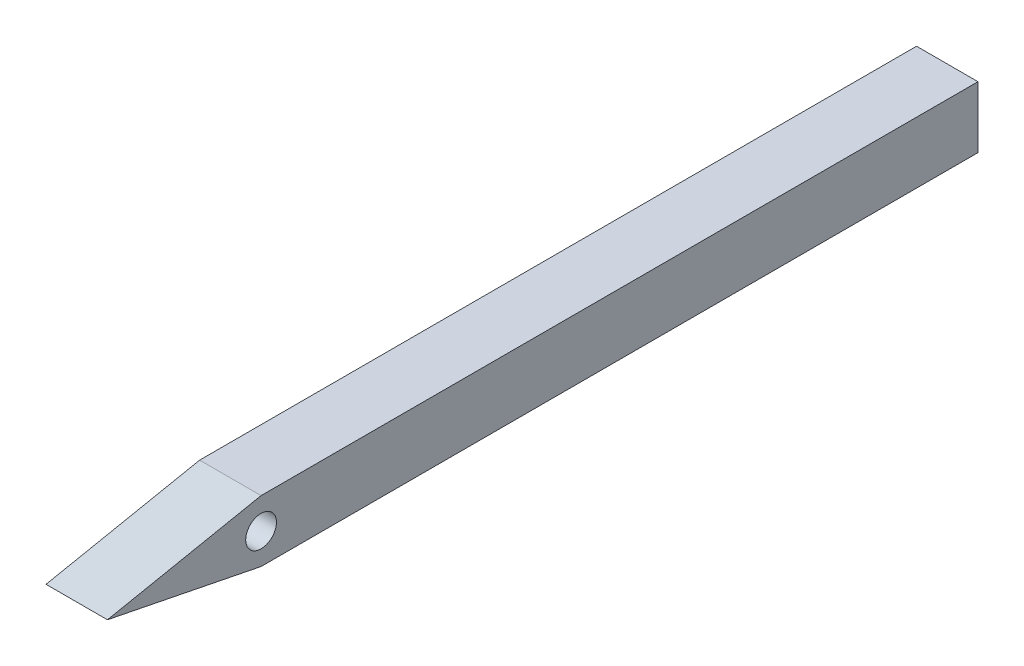
ISO-10303-21;
HEADER;
FILE_DESCRIPTION(('STEP AP214'),'2;1');
FILE_NAME('part.step','',(''),(''),'','','');
FILE_SCHEMA(('AUTOMOTIVE_DESIGN { 1 0 10303 214 1 1 1 1 }'));
ENDSEC;
DATA;
#1=APPLICATION_CONTEXT('core data for automotive mechanical design processes');
#2=APPLICATION_PROTOCOL_DEFINITION('international standard','automotive_design',2000,#1);
#3=PRODUCT_CONTEXT('',#1,'mechanical');
#4=PRODUCT('Part','Part','',(#3));
#5=PRODUCT_RELATED_PRODUCT_CATEGORY('part','',(#4));
#6=PRODUCT_DEFINITION_FORMATION('','',#4);
#7=PRODUCT_DEFINITION_CONTEXT('part definition',#1,'design');
#8=PRODUCT_DEFINITION('design','',#6,#7);
#9=PRODUCT_DEFINITION_SHAPE('','',#8);
#10=(LENGTH_UNIT() NAMED_UNIT(*) SI_UNIT(.MILLI.,.METRE.));
#11=(NAMED_UNIT(*) PLANE_ANGLE_UNIT() SI_UNIT($,.RADIAN.));
#12=(NAMED_UNIT(*) SI_UNIT($,.STERADIAN.) SOLID_ANGLE_UNIT());
#13=UNCERTAINTY_MEASURE_WITH_UNIT(LENGTH_MEASURE(1.E-05),#10,'distance_accuracy_value','');
#14=(GEOMETRIC_REPRESENTATION_CONTEXT(3) GLOBAL_UNCERTAINTY_ASSIGNED_CONTEXT((#13)) GLOBAL_UNIT_ASSIGNED_CONTEXT((#10,
#11,#12)) REPRESENTATION_CONTEXT('',''));
#15=CARTESIAN_POINT('',(0.,0.,0.));
#16=DIRECTION('',(0.,0.,1.));
#17=DIRECTION('',(1.,0.,0.));
#18=AXIS2_PLACEMENT_3D('',#15,#16,#17);
#19=CARTESIAN_POINT('',(6.,0.,0.));
#20=DIRECTION('',(0.,0.,1.));
#21=DIRECTION('',(1.,0.,0.));
#22=AXIS2_PLACEMENT_3D('',#19,#20,#21);
#23=PLANE('',#22);
#24=DIRECTION('',(0.,1.,0.));
#25=VECTOR('',#24,1.);
#26=CARTESIAN_POINT('',(0.,0.,0.));
#27=LINE('',#26,#25);
#28=CARTESIAN_POINT('',(0.,0.,0.));
#29=VERTEX_POINT('',#28);
#30=CARTESIAN_POINT('',(0.,6.,0.));
#31=VERTEX_POINT('',#30);
#32=EDGE_CURVE('E107',#29,#31,#27,.T.);
#33=ORIENTED_EDGE('',*,*,#32,.T.);
#34=DIRECTION('',(-1.,0.,0.));
#35=VECTOR('',#34,1.);
#36=CARTESIAN_POINT('',(6.,6.,0.));
#37=LINE('',#36,#35);
#38=CARTESIAN_POINT('',(6.,6.,0.));
#39=VERTEX_POINT('',#38);
#40=EDGE_CURVE('E11',#39,#31,#37,.T.);
#41=ORIENTED_EDGE('',*,*,#40,.F.);
#42=DIRECTION('',(0.,1.,0.));
#43=VECTOR('',#42,1.);
#44=CARTESIAN_POINT('',(6.,0.,0.));
#45=LINE('',#44,#43);
#46=CARTESIAN_POINT('',(6.,0.,0.));
#47=VERTEX_POINT('',#46);
#48=EDGE_CURVE('E116',#47,#39,#45,.T.);
#49=ORIENTED_EDGE('',*,*,#48,.F.);
#50=DIRECTION('',(-1.,0.,0.));
#51=VECTOR('',#50,1.);
#52=CARTESIAN_POINT('',(6.,0.,0.));
#53=LINE('',#52,#51);
#54=EDGE_CURVE('E103',#47,#29,#53,.T.);
#55=ORIENTED_EDGE('',*,*,#54,.T.);
#56=EDGE_LOOP('',(#33,#41,#49,#55));
#57=FACE_BOUND('',#56,.T.);
#58=ADVANCED_FACE('F33',(#57),#23,.F.);
#59=CARTESIAN_POINT('',(6.,6.,0.));
#60=DIRECTION('',(0.,-1.,0.));
#61=DIRECTION('',(0.,0.,-1.));
#62=AXIS2_PLACEMENT_3D('',#59,#60,#61);
#63=PLANE('',#62);
#64=DIRECTION('',(0.,0.,1.));
#65=VECTOR('',#64,1.);
#66=CARTESIAN_POINT('',(0.,6.,0.));
#67=LINE('',#66,#65);
#68=CARTESIAN_POINT('',(0.,5.99999999999999,70.));
#69=VERTEX_POINT('',#68);
#70=EDGE_CURVE('E110',#31,#69,#67,.T.);
#71=ORIENTED_EDGE('',*,*,#70,.T.);
#72=DIRECTION('',(-1.,0.,0.));
#73=VECTOR('',#72,1.);
#74=CARTESIAN_POINT('',(6.,5.99999999999999,70.));
#75=LINE('',#74,#73);
#76=CARTESIAN_POINT('',(6.,5.99999999999999,70.));
#77=VERTEX_POINT('',#76);
#78=EDGE_CURVE('E41',#77,#69,#75,.T.);
#79=ORIENTED_EDGE('',*,*,#78,.F.);
#80=DIRECTION('',(0.,0.,1.));
#81=VECTOR('',#80,1.);
#82=CARTESIAN_POINT('',(6.,6.,0.));
#83=LINE('',#82,#81);
#84=EDGE_CURVE('E83',#39,#77,#83,.T.);
#85=ORIENTED_EDGE('',*,*,#84,.F.);
#86=ORIENTED_EDGE('',*,*,#40,.T.);
#87=EDGE_LOOP('',(#71,#79,#85,#86));
#88=FACE_BOUND('',#87,.T.);
#89=ADVANCED_FACE('F136',(#88),#63,.F.);
#90=CARTESIAN_POINT('',(6.,5.99999999999999,70.));
#91=DIRECTION('',(0.,-0.98058067569092,-0.196116135138183));
#92=DIRECTION('',(0.,0.196116135138184,-0.98058067569092));
#93=AXIS2_PLACEMENT_3D('',#90,#91,#92);
#94=PLANE('',#93);
#95=DIRECTION('',(0.,-0.196116135138183,0.98058067569092));
#96=VECTOR('',#95,1.);
#97=CARTESIAN_POINT('',(0.,5.99999999999999,70.));
#98=LINE('',#97,#96);
#99=CARTESIAN_POINT('',(0.,3.,85.));
#100=VERTEX_POINT('',#99);
#101=EDGE_CURVE('E98',#69,#100,#98,.T.);
#102=ORIENTED_EDGE('',*,*,#101,.T.);
#103=DIRECTION('',(-1.,0.,0.));
#104=VECTOR('',#103,1.);
#105=CARTESIAN_POINT('',(6.,3.,85.));
#106=LINE('',#105,#104);
#107=CARTESIAN_POINT('',(6.,3.,85.));
#108=VERTEX_POINT('',#107);
#109=EDGE_CURVE('E95',#108,#100,#106,.T.);
#110=ORIENTED_EDGE('',*,*,#109,.F.);
#111=DIRECTION('',(0.,-0.196116135138183,0.98058067569092));
#112=VECTOR('',#111,1.);
#113=CARTESIAN_POINT('',(6.,5.99999999999999,70.));
#114=LINE('',#113,#112);
#115=EDGE_CURVE('E87',#77,#108,#114,.T.);
#116=ORIENTED_EDGE('',*,*,#115,.F.);
#117=ORIENTED_EDGE('',*,*,#78,.T.);
#118=EDGE_LOOP('',(#102,#110,#116,#117));
#119=FACE_BOUND('',#118,.T.);
#120=ADVANCED_FACE('F96',(#119),#94,.F.);
#121=CARTESIAN_POINT('',(6.,3.,85.));
#122=DIRECTION('',(0.,0.98058067569092,-0.196116135138185));
#123=DIRECTION('',(0.,0.196116135138185,0.98058067569092));
#124=AXIS2_PLACEMENT_3D('',#121,#122,#123);
#125=PLANE('',#124);
#126=DIRECTION('',(0.,-0.196116135138185,-0.98058067569092));
#127=VECTOR('',#126,1.);
#128=CARTESIAN_POINT('',(0.,3.,85.));
#129=LINE('',#128,#127);
#130=CARTESIAN_POINT('',(0.,0.,70.));
#131=VERTEX_POINT('',#130);
#132=EDGE_CURVE('E69',#100,#131,#129,.T.);
#133=ORIENTED_EDGE('',*,*,#132,.T.);
#134=DIRECTION('',(-1.,0.,0.));
#135=VECTOR('',#134,1.);
#136=CARTESIAN_POINT('',(6.,0.,70.));
#137=LINE('',#136,#135);
#138=CARTESIAN_POINT('',(6.,0.,70.));
#139=VERTEX_POINT('',#138);
#140=EDGE_CURVE('E99',#139,#131,#137,.T.);
#141=ORIENTED_EDGE('',*,*,#140,.F.);
#142=DIRECTION('',(0.,-0.196116135138185,-0.98058067569092));
#143=VECTOR('',#142,1.);
#144=CARTESIAN_POINT('',(6.,3.,85.));
#145=LINE('',#144,#143);
#146=EDGE_CURVE('E91',#108,#139,#145,.T.);
#147=ORIENTED_EDGE('',*,*,#146,.F.);
#148=ORIENTED_EDGE('',*,*,#109,.T.);
#149=EDGE_LOOP('',(#133,#141,#147,#148));
#150=FACE_BOUND('',#149,.T.);
#151=ADVANCED_FACE('F101',(#150),#125,.F.);
#152=CARTESIAN_POINT('',(6.,0.,0.));
#153=DIRECTION('',(0.,1.,0.));
#154=DIRECTION('',(0.,0.,1.));
#155=AXIS2_PLACEMENT_3D('',#152,#153,#154);
#156=PLANE('',#155);
#157=DIRECTION('',(0.,0.,-1.));
#158=VECTOR('',#157,1.);
#159=CARTESIAN_POINT('',(0.,0.,0.));
#160=LINE('',#159,#158);
#161=EDGE_CURVE('E75',#131,#29,#160,.T.);
#162=ORIENTED_EDGE('',*,*,#161,.T.);
#163=ORIENTED_EDGE('',*,*,#54,.F.);
#164=DIRECTION('',(0.,0.,-1.));
#165=VECTOR('',#164,1.);
#166=CARTESIAN_POINT('',(6.,0.,0.));
#167=LINE('',#166,#165);
#168=EDGE_CURVE('E49',#139,#47,#167,.T.);
#169=ORIENTED_EDGE('',*,*,#168,.F.);
#170=ORIENTED_EDGE('',*,*,#140,.T.);
#171=EDGE_LOOP('',(#162,#163,#169,#170));
#172=FACE_BOUND('',#171,.T.);
#173=ADVANCED_FACE('F124',(#172),#156,.F.);
#174=CARTESIAN_POINT('',(6.,0.,0.));
#175=DIRECTION('',(1.,0.,0.));
#176=DIRECTION('',(0.,0.,-1.));
#177=AXIS2_PLACEMENT_3D('',#174,#175,#176);
#178=PLANE('',#177);
#179=CARTESIAN_POINT('',(6.,2.99999999999999,70.));
#180=DIRECTION('',(1.,0.,0.));
#181=DIRECTION('',(0.,0.,-1.));
#182=AXIS2_PLACEMENT_3D('',#179,#180,#181);
#183=CIRCLE('',#182,1.5);
#184=CARTESIAN_POINT('',(6.,2.99999999999999,68.5));
#185=VERTEX_POINT('',#184);
#186=EDGE_CURVE('E187',#185,#185,#183,.T.);
#187=ORIENTED_EDGE('',*,*,#186,.F.);
#188=EDGE_LOOP('',(#187));
#189=FACE_BOUND('',#188,.T.);
#190=ORIENTED_EDGE('',*,*,#48,.T.);
#191=ORIENTED_EDGE('',*,*,#84,.T.);
#192=ORIENTED_EDGE('',*,*,#115,.T.);
#193=ORIENTED_EDGE('',*,*,#146,.T.);
#194=ORIENTED_EDGE('',*,*,#168,.T.);
#195=EDGE_LOOP('',(#190,#191,#192,#193,#194));
#196=FACE_BOUND('',#195,.T.);
#197=ADVANCED_FACE('F89',(#189,#196),#178,.T.);
#198=CARTESIAN_POINT('',(0.,0.,0.));
#199=DIRECTION('',(1.,0.,0.));
#200=DIRECTION('',(0.,0.,-1.));
#201=AXIS2_PLACEMENT_3D('',#198,#199,#200);
#202=PLANE('',#201);
#203=CARTESIAN_POINT('',(0.,2.99999999999999,70.));
#204=DIRECTION('',(1.,0.,0.));
#205=DIRECTION('',(0.,0.,-1.));
#206=AXIS2_PLACEMENT_3D('',#203,#204,#205);
#207=CIRCLE('',#206,1.5);
#208=CARTESIAN_POINT('',(0.,2.99999999999999,68.5));
#209=VERTEX_POINT('',#208);
#210=EDGE_CURVE('E111',#209,#209,#207,.T.);
#211=ORIENTED_EDGE('',*,*,#210,.T.);
#212=EDGE_LOOP('',(#211));
#213=FACE_BOUND('',#212,.T.);
#214=ORIENTED_EDGE('',*,*,#32,.F.);
#215=ORIENTED_EDGE('',*,*,#161,.F.);
#216=ORIENTED_EDGE('',*,*,#132,.F.);
#217=ORIENTED_EDGE('',*,*,#101,.F.);
#218=ORIENTED_EDGE('',*,*,#70,.F.);
#219=EDGE_LOOP('',(#214,#215,#216,#217,#218));
#220=FACE_BOUND('',#219,.T.);
#221=ADVANCED_FACE('F120',(#213,#220),#202,.F.);
#222=CARTESIAN_POINT('',(0.,2.99999999999999,70.));
#223=DIRECTION('',(1.,0.,0.));
#224=DIRECTION('',(0.,0.,-1.));
#225=AXIS2_PLACEMENT_3D('',#222,#223,#224);
#226=CYLINDRICAL_SURFACE('',#225,1.5);
#227=ORIENTED_EDGE('',*,*,#210,.F.);
#228=EDGE_LOOP('',(#227));
#229=FACE_BOUND('',#228,.T.);
#230=ORIENTED_EDGE('',*,*,#186,.T.);
#231=EDGE_LOOP('',(#230));
#232=FACE_BOUND('',#231,.T.);
#233=ADVANCED_FACE('F169',(#229,#232),#226,.F.);
#234=CLOSED_SHELL('',(#58,#89,#120,#151,#173,#197,#221,#233));
#235=MANIFOLD_SOLID_BREP('B2',#234);
#236=ADVANCED_BREP_SHAPE_REPRESENTATION('',(#18,#235),#14);
#237=SHAPE_DEFINITION_REPRESENTATION(#9,#236);
ENDSEC;
END-ISO-10303-21;
